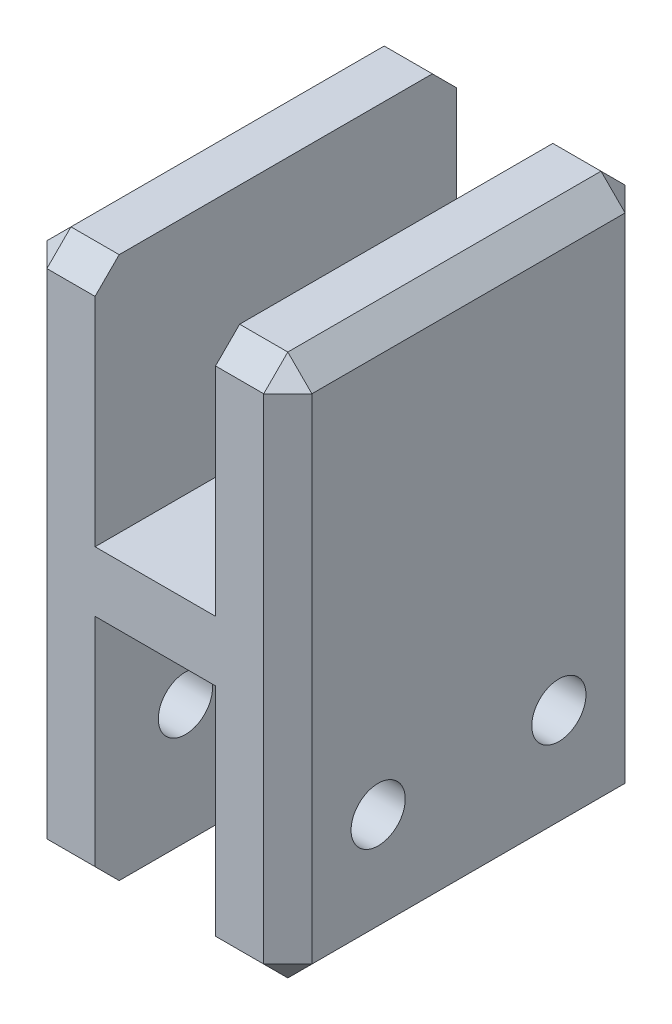
ISO-10303-21;
HEADER;
FILE_DESCRIPTION(('STEP AP214'),'2;1');
FILE_NAME('part.step','',(''),(''),'','','');
FILE_SCHEMA(('AUTOMOTIVE_DESIGN { 1 0 10303 214 1 1 1 1 }'));
ENDSEC;
DATA;
#1=APPLICATION_CONTEXT('core data for automotive mechanical design processes');
#2=APPLICATION_PROTOCOL_DEFINITION('international standard','automotive_design',2000,#1);
#3=PRODUCT_CONTEXT('',#1,'mechanical');
#4=PRODUCT('Part','Part','',(#3));
#5=PRODUCT_RELATED_PRODUCT_CATEGORY('part','',(#4));
#6=PRODUCT_DEFINITION_FORMATION('','',#4);
#7=PRODUCT_DEFINITION_CONTEXT('part definition',#1,'design');
#8=PRODUCT_DEFINITION('design','',#6,#7);
#9=PRODUCT_DEFINITION_SHAPE('','',#8);
#10=(LENGTH_UNIT() NAMED_UNIT(*) SI_UNIT(.MILLI.,.METRE.));
#11=(NAMED_UNIT(*) PLANE_ANGLE_UNIT() SI_UNIT($,.RADIAN.));
#12=(NAMED_UNIT(*) SI_UNIT($,.STERADIAN.) SOLID_ANGLE_UNIT());
#13=UNCERTAINTY_MEASURE_WITH_UNIT(LENGTH_MEASURE(1.E-05),#10,'distance_accuracy_value','');
#14=(GEOMETRIC_REPRESENTATION_CONTEXT(3) GLOBAL_UNCERTAINTY_ASSIGNED_CONTEXT((#13)) GLOBAL_UNIT_ASSIGNED_CONTEXT((#10,
#11,#12)) REPRESENTATION_CONTEXT('',''));
#15=CARTESIAN_POINT('',(0.,0.,0.));
#16=DIRECTION('',(0.,0.,1.));
#17=DIRECTION('',(1.,0.,0.));
#18=AXIS2_PLACEMENT_3D('',#15,#16,#17);
#19=CARTESIAN_POINT('',(-5.,20.,30.));
#20=DIRECTION('',(0.,-1.,0.));
#21=DIRECTION('',(1.,0.,0.));
#22=AXIS2_PLACEMENT_3D('',#19,#20,#21);
#23=PLANE('',#22);
#24=DIRECTION('',(0.,0.,-1.));
#25=VECTOR('',#24,1.);
#26=CARTESIAN_POINT('',(-5.,20.,30.));
#27=LINE('',#26,#25);
#28=CARTESIAN_POINT('',(-5.,20.,28.));
#29=VERTEX_POINT('',#28);
#30=CARTESIAN_POINT('',(-5.,20.,1.99999999999999));
#31=VERTEX_POINT('',#30);
#32=EDGE_CURVE('E241',#29,#31,#27,.T.);
#33=ORIENTED_EDGE('',*,*,#32,.T.);
#34=DIRECTION('',(-1.,0.,0.));
#35=VECTOR('',#34,1.);
#36=CARTESIAN_POINT('',(-11.,20.,1.99999999999999));
#37=LINE('',#36,#35);
#38=CARTESIAN_POINT('',(-9.00000000000001,20.,1.99999999999999));
#39=VERTEX_POINT('',#38);
#40=EDGE_CURVE('E349',#31,#39,#37,.T.);
#41=ORIENTED_EDGE('',*,*,#40,.T.);
#42=DIRECTION('',(0.,0.,1.));
#43=VECTOR('',#42,1.);
#44=CARTESIAN_POINT('',(-9.00000000000001,20.,30.));
#45=LINE('',#44,#43);
#46=CARTESIAN_POINT('',(-9.00000000000001,20.,28.));
#47=VERTEX_POINT('',#46);
#48=EDGE_CURVE('E345',#39,#47,#45,.T.);
#49=ORIENTED_EDGE('',*,*,#48,.T.);
#50=DIRECTION('',(1.,0.,0.));
#51=VECTOR('',#50,1.);
#52=CARTESIAN_POINT('',(-5.,20.,28.));
#53=LINE('',#52,#51);
#54=EDGE_CURVE('E347',#47,#29,#53,.T.);
#55=ORIENTED_EDGE('',*,*,#54,.T.);
#56=EDGE_LOOP('',(#33,#41,#49,#55));
#57=FACE_BOUND('',#56,.T.);
#58=ADVANCED_FACE('F39',(#57),#23,.F.);
#59=CARTESIAN_POINT('',(-11.,-25.,30.));
#60=DIRECTION('',(1.,0.,0.));
#61=DIRECTION('',(0.,1.,0.));
#62=AXIS2_PLACEMENT_3D('',#59,#60,#61);
#63=PLANE('',#62);
#64=DIRECTION('',(0.,1.,0.));
#65=VECTOR('',#64,1.);
#66=CARTESIAN_POINT('',(-11.,-25.,28.));
#67=LINE('',#66,#65);
#68=CARTESIAN_POINT('',(-11.,-23.,28.));
#69=VERTEX_POINT('',#68);
#70=CARTESIAN_POINT('',(-11.,18.,28.));
#71=VERTEX_POINT('',#70);
#72=EDGE_CURVE('E49',#69,#71,#67,.T.);
#73=ORIENTED_EDGE('',*,*,#72,.T.);
#74=DIRECTION('',(0.,0.,-1.));
#75=VECTOR('',#74,1.);
#76=CARTESIAN_POINT('',(-11.,18.,30.));
#77=LINE('',#76,#75);
#78=CARTESIAN_POINT('',(-11.,18.,1.99999999999999));
#79=VERTEX_POINT('',#78);
#80=EDGE_CURVE('E11',#71,#79,#77,.T.);
#81=ORIENTED_EDGE('',*,*,#80,.T.);
#82=DIRECTION('',(0.,-1.,0.));
#83=VECTOR('',#82,1.);
#84=CARTESIAN_POINT('',(-11.,-25.,1.99999999999999));
#85=LINE('',#84,#83);
#86=CARTESIAN_POINT('',(-11.,-23.,1.99999999999999));
#87=VERTEX_POINT('',#86);
#88=EDGE_CURVE('E63',#79,#87,#85,.T.);
#89=ORIENTED_EDGE('',*,*,#88,.T.);
#90=DIRECTION('',(0.,0.,1.));
#91=VECTOR('',#90,1.);
#92=CARTESIAN_POINT('',(-11.,-23.,30.));
#93=LINE('',#92,#91);
#94=EDGE_CURVE('E355',#87,#69,#93,.T.);
#95=ORIENTED_EDGE('',*,*,#94,.T.);
#96=EDGE_LOOP('',(#73,#81,#89,#95));
#97=FACE_BOUND('',#96,.T.);
#98=CARTESIAN_POINT('',(-11.,-15.,7.5));
#99=DIRECTION('',(-1.,0.,0.));
#100=DIRECTION('',(0.,0.,1.));
#101=AXIS2_PLACEMENT_3D('',#98,#99,#100);
#102=CIRCLE('',#101,5.);
#103=CARTESIAN_POINT('',(-11.,-15.,12.5));
#104=VERTEX_POINT('',#103);
#105=EDGE_CURVE('E393',#104,#104,#102,.T.);
#106=ORIENTED_EDGE('',*,*,#105,.F.);
#107=EDGE_LOOP('',(#106));
#108=FACE_BOUND('',#107,.T.);
#109=CARTESIAN_POINT('',(-11.,-15.,22.5));
#110=DIRECTION('',(-1.,0.,0.));
#111=DIRECTION('',(0.,0.,1.));
#112=AXIS2_PLACEMENT_3D('',#109,#110,#111);
#113=CIRCLE('',#112,5.);
#114=CARTESIAN_POINT('',(-11.,-15.,27.5));
#115=VERTEX_POINT('',#114);
#116=EDGE_CURVE('E1118',#115,#115,#113,.T.);
#117=ORIENTED_EDGE('',*,*,#116,.F.);
#118=EDGE_LOOP('',(#117));
#119=FACE_BOUND('',#118,.T.);
#120=ADVANCED_FACE('F452',(#97,#108,#119),#63,.F.);
#121=CARTESIAN_POINT('',(-5.,-25.,30.));
#122=DIRECTION('',(0.,1.,0.));
#123=DIRECTION('',(-1.,0.,0.));
#124=AXIS2_PLACEMENT_3D('',#121,#122,#123);
#125=PLANE('',#124);
#126=DIRECTION('',(0.,0.,-1.));
#127=VECTOR('',#126,1.);
#128=CARTESIAN_POINT('',(-9.00000000000001,-25.,30.));
#129=LINE('',#128,#127);
#130=CARTESIAN_POINT('',(-9.00000000000001,-25.,28.));
#131=VERTEX_POINT('',#130);
#132=CARTESIAN_POINT('',(-9.00000000000001,-25.,1.99999999999999));
#133=VERTEX_POINT('',#132);
#134=EDGE_CURVE('E334',#131,#133,#129,.T.);
#135=ORIENTED_EDGE('',*,*,#134,.T.);
#136=DIRECTION('',(1.,0.,0.));
#137=VECTOR('',#136,1.);
#138=CARTESIAN_POINT('',(-5.,-25.,1.99999999999999));
#139=LINE('',#138,#137);
#140=CARTESIAN_POINT('',(-5.,-25.,1.99999999999999));
#141=VERTEX_POINT('',#140);
#142=EDGE_CURVE('E338',#133,#141,#139,.T.);
#143=ORIENTED_EDGE('',*,*,#142,.T.);
#144=DIRECTION('',(0.,0.,-1.));
#145=VECTOR('',#144,1.);
#146=CARTESIAN_POINT('',(-5.,-25.,30.));
#147=LINE('',#146,#145);
#148=CARTESIAN_POINT('',(-5.,-25.,28.));
#149=VERTEX_POINT('',#148);
#150=EDGE_CURVE('E223',#149,#141,#147,.T.);
#151=ORIENTED_EDGE('',*,*,#150,.F.);
#152=DIRECTION('',(-1.,0.,0.));
#153=VECTOR('',#152,1.);
#154=CARTESIAN_POINT('',(-5.,-25.,28.));
#155=LINE('',#154,#153);
#156=EDGE_CURVE('E336',#149,#131,#155,.T.);
#157=ORIENTED_EDGE('',*,*,#156,.T.);
#158=EDGE_LOOP('',(#135,#143,#151,#157));
#159=FACE_BOUND('',#158,.T.);
#160=ADVANCED_FACE('F471',(#159),#125,.F.);
#161=CARTESIAN_POINT('',(-5.,-5.,30.));
#162=DIRECTION('',(-1.,0.,0.));
#163=DIRECTION('',(0.,-1.,0.));
#164=AXIS2_PLACEMENT_3D('',#161,#162,#163);
#165=PLANE('',#164);
#166=CARTESIAN_POINT('',(-5.,-15.,7.5));
#167=DIRECTION('',(-1.,0.,0.));
#168=DIRECTION('',(0.,-1.,0.));
#169=AXIS2_PLACEMENT_3D('',#166,#167,#168);
#170=CIRCLE('',#169,2.25);
#171=CARTESIAN_POINT('',(-5.,-17.25,7.5));
#172=VERTEX_POINT('',#171);
#173=EDGE_CURVE('E280',#172,#172,#170,.T.);
#174=ORIENTED_EDGE('',*,*,#173,.T.);
#175=EDGE_LOOP('',(#174));
#176=FACE_BOUND('',#175,.T.);
#177=CARTESIAN_POINT('',(-5.,-15.,22.5));
#178=DIRECTION('',(-1.,0.,0.));
#179=DIRECTION('',(0.,-1.,0.));
#180=AXIS2_PLACEMENT_3D('',#177,#178,#179);
#181=CIRCLE('',#180,2.25);
#182=CARTESIAN_POINT('',(-5.,-17.25,22.5));
#183=VERTEX_POINT('',#182);
#184=EDGE_CURVE('E275',#183,#183,#181,.T.);
#185=ORIENTED_EDGE('',*,*,#184,.T.);
#186=EDGE_LOOP('',(#185));
#187=FACE_BOUND('',#186,.T.);
#188=ORIENTED_EDGE('',*,*,#150,.T.);
#189=DIRECTION('',(0.,0.707106781186549,-0.707106781186546));
#190=VECTOR('',#189,1.);
#191=CARTESIAN_POINT('',(-5.,-25.,1.99999999999999));
#192=LINE('',#191,#190);
#193=CARTESIAN_POINT('',(-5.,-23.,0.));
#194=VERTEX_POINT('',#193);
#195=EDGE_CURVE('E343',#141,#194,#192,.T.);
#196=ORIENTED_EDGE('',*,*,#195,.T.);
#197=DIRECTION('',(0.,1.,0.));
#198=VECTOR('',#197,1.);
#199=CARTESIAN_POINT('',(-5.,-5.,0.));
#200=LINE('',#199,#198);
#201=CARTESIAN_POINT('',(-5.,-5.,0.));
#202=VERTEX_POINT('',#201);
#203=EDGE_CURVE('E220',#194,#202,#200,.T.);
#204=ORIENTED_EDGE('',*,*,#203,.T.);
#205=DIRECTION('',(0.,0.,-1.));
#206=VECTOR('',#205,1.);
#207=CARTESIAN_POINT('',(-5.,-5.,30.));
#208=LINE('',#207,#206);
#209=CARTESIAN_POINT('',(-5.,-5.,30.));
#210=VERTEX_POINT('',#209);
#211=EDGE_CURVE('E216',#210,#202,#208,.T.);
#212=ORIENTED_EDGE('',*,*,#211,.F.);
#213=DIRECTION('',(0.,1.,0.));
#214=VECTOR('',#213,1.);
#215=CARTESIAN_POINT('',(-5.,-5.,30.));
#216=LINE('',#215,#214);
#217=CARTESIAN_POINT('',(-5.,-23.,30.));
#218=VERTEX_POINT('',#217);
#219=EDGE_CURVE('E202',#218,#210,#216,.T.);
#220=ORIENTED_EDGE('',*,*,#219,.F.);
#221=DIRECTION('',(0.,0.707106781186549,0.707106781186546));
#222=VECTOR('',#221,1.);
#223=CARTESIAN_POINT('',(-5.,-23.,30.));
#224=LINE('',#223,#222);
#225=EDGE_CURVE('E341',#218,#149,#224,.F.);
#226=ORIENTED_EDGE('',*,*,#225,.T.);
#227=EDGE_LOOP('',(#188,#196,#204,#212,#220,#226));
#228=FACE_BOUND('',#227,.T.);
#229=ADVANCED_FACE('F218',(#176,#187,#228),#165,.F.);
#230=CARTESIAN_POINT('',(5.,-5.,30.));
#231=DIRECTION('',(0.,1.,0.));
#232=DIRECTION('',(0.,0.,1.));
#233=AXIS2_PLACEMENT_3D('',#230,#231,#232);
#234=PLANE('',#233);
#235=DIRECTION('',(1.,0.,0.));
#236=VECTOR('',#235,1.);
#237=CARTESIAN_POINT('',(5.,-5.,0.));
#238=LINE('',#237,#236);
#239=CARTESIAN_POINT('',(5.,-5.,0.));
#240=VERTEX_POINT('',#239);
#241=EDGE_CURVE('E243',#202,#240,#238,.T.);
#242=ORIENTED_EDGE('',*,*,#241,.T.);
#243=DIRECTION('',(0.,0.,-1.));
#244=VECTOR('',#243,1.);
#245=CARTESIAN_POINT('',(5.,-5.,30.));
#246=LINE('',#245,#244);
#247=CARTESIAN_POINT('',(5.,-5.,30.));
#248=VERTEX_POINT('',#247);
#249=EDGE_CURVE('E224',#248,#240,#246,.T.);
#250=ORIENTED_EDGE('',*,*,#249,.F.);
#251=DIRECTION('',(1.,0.,0.));
#252=VECTOR('',#251,1.);
#253=CARTESIAN_POINT('',(5.,-5.,30.));
#254=LINE('',#253,#252);
#255=EDGE_CURVE('E207',#210,#248,#254,.T.);
#256=ORIENTED_EDGE('',*,*,#255,.F.);
#257=ORIENTED_EDGE('',*,*,#211,.T.);
#258=EDGE_LOOP('',(#242,#250,#256,#257));
#259=FACE_BOUND('',#258,.T.);
#260=ADVANCED_FACE('F226',(#259),#234,.F.);
#261=CARTESIAN_POINT('',(5.,-25.,30.));
#262=DIRECTION('',(1.,0.,0.));
#263=DIRECTION('',(0.,1.,0.));
#264=AXIS2_PLACEMENT_3D('',#261,#262,#263);
#265=PLANE('',#264);
#266=CARTESIAN_POINT('',(5.,-15.,7.5));
#267=DIRECTION('',(1.,0.,0.));
#268=DIRECTION('',(0.,1.,0.));
#269=AXIS2_PLACEMENT_3D('',#266,#267,#268);
#270=CIRCLE('',#269,2.25);
#271=CARTESIAN_POINT('',(5.,-12.75,7.5));
#272=VERTEX_POINT('',#271);
#273=EDGE_CURVE('E277',#272,#272,#270,.T.);
#274=ORIENTED_EDGE('',*,*,#273,.T.);
#275=EDGE_LOOP('',(#274));
#276=FACE_BOUND('',#275,.T.);
#277=CARTESIAN_POINT('',(5.,-15.,22.5));
#278=DIRECTION('',(1.,0.,0.));
#279=DIRECTION('',(0.,1.,0.));
#280=AXIS2_PLACEMENT_3D('',#277,#278,#279);
#281=CIRCLE('',#280,2.25);
#282=CARTESIAN_POINT('',(5.,-12.75,22.5));
#283=VERTEX_POINT('',#282);
#284=EDGE_CURVE('E244',#283,#283,#281,.T.);
#285=ORIENTED_EDGE('',*,*,#284,.T.);
#286=EDGE_LOOP('',(#285));
#287=FACE_BOUND('',#286,.T.);
#288=DIRECTION('',(0.,-1.,0.));
#289=VECTOR('',#288,1.);
#290=CARTESIAN_POINT('',(5.,-25.,0.));
#291=LINE('',#290,#289);
#292=CARTESIAN_POINT('',(5.,-23.,0.));
#293=VERTEX_POINT('',#292);
#294=EDGE_CURVE('E246',#240,#293,#291,.T.);
#295=ORIENTED_EDGE('',*,*,#294,.T.);
#296=DIRECTION('',(0.,-0.707106781186548,0.707106781186547));
#297=VECTOR('',#296,1.);
#298=CARTESIAN_POINT('',(5.,-25.,2.));
#299=LINE('',#298,#297);
#300=CARTESIAN_POINT('',(5.,-25.,2.));
#301=VERTEX_POINT('',#300);
#302=EDGE_CURVE('E302',#293,#301,#299,.T.);
#303=ORIENTED_EDGE('',*,*,#302,.T.);
#304=DIRECTION('',(0.,0.,-1.));
#305=VECTOR('',#304,1.);
#306=CARTESIAN_POINT('',(5.,-25.,30.));
#307=LINE('',#306,#305);
#308=CARTESIAN_POINT('',(5.,-25.,28.));
#309=VERTEX_POINT('',#308);
#310=EDGE_CURVE('E266',#309,#301,#307,.T.);
#311=ORIENTED_EDGE('',*,*,#310,.F.);
#312=DIRECTION('',(0.,-0.707106781186548,-0.707106781186547));
#313=VECTOR('',#312,1.);
#314=CARTESIAN_POINT('',(5.,-23.,30.));
#315=LINE('',#314,#313);
#316=CARTESIAN_POINT('',(5.,-23.,30.));
#317=VERTEX_POINT('',#316);
#318=EDGE_CURVE('E300',#309,#317,#315,.F.);
#319=ORIENTED_EDGE('',*,*,#318,.T.);
#320=DIRECTION('',(0.,-1.,0.));
#321=VECTOR('',#320,1.);
#322=CARTESIAN_POINT('',(5.,-25.,30.));
#323=LINE('',#322,#321);
#324=EDGE_CURVE('E229',#248,#317,#323,.T.);
#325=ORIENTED_EDGE('',*,*,#324,.F.);
#326=ORIENTED_EDGE('',*,*,#249,.T.);
#327=EDGE_LOOP('',(#295,#303,#311,#319,#325,#326));
#328=FACE_BOUND('',#327,.T.);
#329=ADVANCED_FACE('F490',(#276,#287,#328),#265,.F.);
#330=CARTESIAN_POINT('',(11.,-25.,30.));
#331=DIRECTION('',(0.,1.,0.));
#332=DIRECTION('',(-1.,0.,0.));
#333=AXIS2_PLACEMENT_3D('',#330,#331,#332);
#334=PLANE('',#333);
#335=ORIENTED_EDGE('',*,*,#310,.T.);
#336=DIRECTION('',(1.,0.,0.));
#337=VECTOR('',#336,1.);
#338=CARTESIAN_POINT('',(11.,-25.,2.));
#339=LINE('',#338,#337);
#340=CARTESIAN_POINT('',(9.,-25.,2.));
#341=VERTEX_POINT('',#340);
#342=EDGE_CURVE('E285',#301,#341,#339,.T.);
#343=ORIENTED_EDGE('',*,*,#342,.T.);
#344=DIRECTION('',(0.,0.,1.));
#345=VECTOR('',#344,1.);
#346=CARTESIAN_POINT('',(9.,-25.,30.));
#347=LINE('',#346,#345);
#348=CARTESIAN_POINT('',(9.,-25.,28.));
#349=VERTEX_POINT('',#348);
#350=EDGE_CURVE('E271',#341,#349,#347,.T.);
#351=ORIENTED_EDGE('',*,*,#350,.T.);
#352=DIRECTION('',(-1.,0.,0.));
#353=VECTOR('',#352,1.);
#354=CARTESIAN_POINT('',(11.,-25.,28.));
#355=LINE('',#354,#353);
#356=EDGE_CURVE('E283',#349,#309,#355,.T.);
#357=ORIENTED_EDGE('',*,*,#356,.T.);
#358=EDGE_LOOP('',(#335,#343,#351,#357));
#359=FACE_BOUND('',#358,.T.);
#360=ADVANCED_FACE('F554',(#359),#334,.F.);
#361=CARTESIAN_POINT('',(11.,-25.,30.));
#362=DIRECTION('',(-1.,0.,0.));
#363=DIRECTION('',(0.,-1.,0.));
#364=AXIS2_PLACEMENT_3D('',#361,#362,#363);
#365=PLANE('',#364);
#366=DIRECTION('',(0.,-1.,0.));
#367=VECTOR('',#366,1.);
#368=CARTESIAN_POINT('',(11.,-25.,28.));
#369=LINE('',#368,#367);
#370=CARTESIAN_POINT('',(11.,18.,28.));
#371=VERTEX_POINT('',#370);
#372=CARTESIAN_POINT('',(11.,-23.,28.));
#373=VERTEX_POINT('',#372);
#374=EDGE_CURVE('E317',#371,#373,#369,.T.);
#375=ORIENTED_EDGE('',*,*,#374,.T.);
#376=DIRECTION('',(0.,0.,-1.));
#377=VECTOR('',#376,1.);
#378=CARTESIAN_POINT('',(11.,-23.,30.));
#379=LINE('',#378,#377);
#380=CARTESIAN_POINT('',(11.,-23.,2.));
#381=VERTEX_POINT('',#380);
#382=EDGE_CURVE('E321',#373,#381,#379,.T.);
#383=ORIENTED_EDGE('',*,*,#382,.T.);
#384=DIRECTION('',(0.,1.,0.));
#385=VECTOR('',#384,1.);
#386=CARTESIAN_POINT('',(11.,20.,2.));
#387=LINE('',#386,#385);
#388=CARTESIAN_POINT('',(11.,18.,2.));
#389=VERTEX_POINT('',#388);
#390=EDGE_CURVE('E319',#381,#389,#387,.T.);
#391=ORIENTED_EDGE('',*,*,#390,.T.);
#392=DIRECTION('',(0.,0.,1.));
#393=VECTOR('',#392,1.);
#394=CARTESIAN_POINT('',(11.,18.,30.));
#395=LINE('',#394,#393);
#396=EDGE_CURVE('E315',#389,#371,#395,.T.);
#397=ORIENTED_EDGE('',*,*,#396,.T.);
#398=EDGE_LOOP('',(#375,#383,#391,#397));
#399=FACE_BOUND('',#398,.T.);
#400=CARTESIAN_POINT('',(11.,-15.,7.5));
#401=DIRECTION('',(-1.,0.,0.));
#402=DIRECTION('',(0.,-1.,0.));
#403=AXIS2_PLACEMENT_3D('',#400,#401,#402);
#404=CIRCLE('',#403,2.25);
#405=CARTESIAN_POINT('',(11.,-17.25,7.5));
#406=VERTEX_POINT('',#405);
#407=EDGE_CURVE('E1121',#406,#406,#404,.T.);
#408=ORIENTED_EDGE('',*,*,#407,.T.);
#409=EDGE_LOOP('',(#408));
#410=FACE_BOUND('',#409,.T.);
#411=CARTESIAN_POINT('',(11.,-15.,22.5));
#412=DIRECTION('',(-1.,0.,0.));
#413=DIRECTION('',(0.,-1.,0.));
#414=AXIS2_PLACEMENT_3D('',#411,#412,#413);
#415=CIRCLE('',#414,2.25);
#416=CARTESIAN_POINT('',(11.,-17.25,22.5));
#417=VERTEX_POINT('',#416);
#418=EDGE_CURVE('E272',#417,#417,#415,.T.);
#419=ORIENTED_EDGE('',*,*,#418,.T.);
#420=EDGE_LOOP('',(#419));
#421=FACE_BOUND('',#420,.T.);
#422=ADVANCED_FACE('F556',(#399,#410,#421),#365,.F.);
#423=CARTESIAN_POINT('',(11.,20.,30.));
#424=DIRECTION('',(0.,-1.,0.));
#425=DIRECTION('',(1.,0.,0.));
#426=AXIS2_PLACEMENT_3D('',#423,#424,#425);
#427=PLANE('',#426);
#428=DIRECTION('',(0.,0.,-1.));
#429=VECTOR('',#428,1.);
#430=CARTESIAN_POINT('',(8.99999999999999,20.,30.));
#431=LINE('',#430,#429);
#432=CARTESIAN_POINT('',(8.99999999999999,20.,28.));
#433=VERTEX_POINT('',#432);
#434=CARTESIAN_POINT('',(8.99999999999999,20.,2.));
#435=VERTEX_POINT('',#434);
#436=EDGE_CURVE('E326',#433,#435,#431,.T.);
#437=ORIENTED_EDGE('',*,*,#436,.T.);
#438=DIRECTION('',(-1.,0.,0.));
#439=VECTOR('',#438,1.);
#440=CARTESIAN_POINT('',(5.,20.,2.));
#441=LINE('',#440,#439);
#442=CARTESIAN_POINT('',(5.,20.,2.));
#443=VERTEX_POINT('',#442);
#444=EDGE_CURVE('E328',#435,#443,#441,.T.);
#445=ORIENTED_EDGE('',*,*,#444,.T.);
#446=DIRECTION('',(0.,0.,-1.));
#447=VECTOR('',#446,1.);
#448=CARTESIAN_POINT('',(5.,20.,30.));
#449=LINE('',#448,#447);
#450=CARTESIAN_POINT('',(5.,20.,28.));
#451=VERTEX_POINT('',#450);
#452=EDGE_CURVE('E263',#451,#443,#449,.T.);
#453=ORIENTED_EDGE('',*,*,#452,.F.);
#454=DIRECTION('',(1.,0.,0.));
#455=VECTOR('',#454,1.);
#456=CARTESIAN_POINT('',(11.,20.,28.));
#457=LINE('',#456,#455);
#458=EDGE_CURVE('E324',#451,#433,#457,.T.);
#459=ORIENTED_EDGE('',*,*,#458,.T.);
#460=EDGE_LOOP('',(#437,#445,#453,#459));
#461=FACE_BOUND('',#460,.T.);
#462=ADVANCED_FACE('F526',(#461),#427,.F.);
#463=CARTESIAN_POINT('',(5.,20.,30.));
#464=DIRECTION('',(1.,0.,0.));
#465=DIRECTION('',(0.,1.,0.));
#466=AXIS2_PLACEMENT_3D('',#463,#464,#465);
#467=PLANE('',#466);
#468=ORIENTED_EDGE('',*,*,#452,.T.);
#469=DIRECTION('',(0.,-0.707106781186547,-0.707106781186548));
#470=VECTOR('',#469,1.);
#471=CARTESIAN_POINT('',(5.,20.,2.));
#472=LINE('',#471,#470);
#473=CARTESIAN_POINT('',(5.,18.,0.));
#474=VERTEX_POINT('',#473);
#475=EDGE_CURVE('E332',#443,#474,#472,.T.);
#476=ORIENTED_EDGE('',*,*,#475,.T.);
#477=DIRECTION('',(0.,-1.,0.));
#478=VECTOR('',#477,1.);
#479=CARTESIAN_POINT('',(5.,20.,0.));
#480=LINE('',#479,#478);
#481=CARTESIAN_POINT('',(5.,0.,0.));
#482=VERTEX_POINT('',#481);
#483=EDGE_CURVE('E249',#474,#482,#480,.T.);
#484=ORIENTED_EDGE('',*,*,#483,.T.);
#485=DIRECTION('',(0.,0.,-1.));
#486=VECTOR('',#485,1.);
#487=CARTESIAN_POINT('',(5.,0.,30.));
#488=LINE('',#487,#486);
#489=CARTESIAN_POINT('',(5.,0.,30.));
#490=VERTEX_POINT('',#489);
#491=EDGE_CURVE('E260',#490,#482,#488,.T.);
#492=ORIENTED_EDGE('',*,*,#491,.F.);
#493=DIRECTION('',(0.,-1.,0.));
#494=VECTOR('',#493,1.);
#495=CARTESIAN_POINT('',(5.,20.,30.));
#496=LINE('',#495,#494);
#497=CARTESIAN_POINT('',(5.,18.,30.));
#498=VERTEX_POINT('',#497);
#499=EDGE_CURVE('E231',#498,#490,#496,.T.);
#500=ORIENTED_EDGE('',*,*,#499,.F.);
#501=DIRECTION('',(0.,-0.707106781186547,0.707106781186548));
#502=VECTOR('',#501,1.);
#503=CARTESIAN_POINT('',(5.,18.,30.));
#504=LINE('',#503,#502);
#505=EDGE_CURVE('E330',#498,#451,#504,.F.);
#506=ORIENTED_EDGE('',*,*,#505,.T.);
#507=EDGE_LOOP('',(#468,#476,#484,#492,#500,#506));
#508=FACE_BOUND('',#507,.T.);
#509=ADVANCED_FACE('F535',(#508),#467,.F.);
#510=CARTESIAN_POINT('',(5.,0.,30.));
#511=DIRECTION('',(0.,-1.,0.));
#512=DIRECTION('',(0.,0.,-1.));
#513=AXIS2_PLACEMENT_3D('',#510,#511,#512);
#514=PLANE('',#513);
#515=DIRECTION('',(-1.,0.,0.));
#516=VECTOR('',#515,1.);
#517=CARTESIAN_POINT('',(5.,0.,0.));
#518=LINE('',#517,#516);
#519=CARTESIAN_POINT('',(-5.,0.,0.));
#520=VERTEX_POINT('',#519);
#521=EDGE_CURVE('E251',#482,#520,#518,.T.);
#522=ORIENTED_EDGE('',*,*,#521,.T.);
#523=DIRECTION('',(0.,0.,-1.));
#524=VECTOR('',#523,1.);
#525=CARTESIAN_POINT('',(-5.,0.,30.));
#526=LINE('',#525,#524);
#527=CARTESIAN_POINT('',(-5.,0.,30.));
#528=VERTEX_POINT('',#527);
#529=EDGE_CURVE('E257',#528,#520,#526,.T.);
#530=ORIENTED_EDGE('',*,*,#529,.F.);
#531=DIRECTION('',(-1.,0.,0.));
#532=VECTOR('',#531,1.);
#533=CARTESIAN_POINT('',(5.,0.,30.));
#534=LINE('',#533,#532);
#535=EDGE_CURVE('E236',#490,#528,#534,.T.);
#536=ORIENTED_EDGE('',*,*,#535,.F.);
#537=ORIENTED_EDGE('',*,*,#491,.T.);
#538=EDGE_LOOP('',(#522,#530,#536,#537));
#539=FACE_BOUND('',#538,.T.);
#540=ADVANCED_FACE('F824',(#539),#514,.F.);
#541=CARTESIAN_POINT('',(-5.,0.,30.));
#542=DIRECTION('',(-1.,0.,0.));
#543=DIRECTION('',(0.,-1.,0.));
#544=AXIS2_PLACEMENT_3D('',#541,#542,#543);
#545=PLANE('',#544);
#546=DIRECTION('',(0.,1.,0.));
#547=VECTOR('',#546,1.);
#548=CARTESIAN_POINT('',(-5.,0.,0.));
#549=LINE('',#548,#547);
#550=CARTESIAN_POINT('',(-5.,18.,0.));
#551=VERTEX_POINT('',#550);
#552=EDGE_CURVE('E213',#520,#551,#549,.T.);
#553=ORIENTED_EDGE('',*,*,#552,.T.);
#554=DIRECTION('',(0.,0.707106781186549,0.707106781186546));
#555=VECTOR('',#554,1.);
#556=CARTESIAN_POINT('',(-5.,20.,1.99999999999999));
#557=LINE('',#556,#555);
#558=EDGE_CURVE('E353',#551,#31,#557,.T.);
#559=ORIENTED_EDGE('',*,*,#558,.T.);
#560=ORIENTED_EDGE('',*,*,#32,.F.);
#561=DIRECTION('',(0.,0.707106781186546,-0.707106781186549));
#562=VECTOR('',#561,1.);
#563=CARTESIAN_POINT('',(-5.,18.,30.));
#564=LINE('',#563,#562);
#565=CARTESIAN_POINT('',(-5.,18.,30.));
#566=VERTEX_POINT('',#565);
#567=EDGE_CURVE('E351',#29,#566,#564,.F.);
#568=ORIENTED_EDGE('',*,*,#567,.T.);
#569=DIRECTION('',(0.,1.,0.));
#570=VECTOR('',#569,1.);
#571=CARTESIAN_POINT('',(-5.,0.,30.));
#572=LINE('',#571,#570);
#573=EDGE_CURVE('E238',#528,#566,#572,.T.);
#574=ORIENTED_EDGE('',*,*,#573,.F.);
#575=ORIENTED_EDGE('',*,*,#529,.T.);
#576=EDGE_LOOP('',(#553,#559,#560,#568,#574,#575));
#577=FACE_BOUND('',#576,.T.);
#578=ADVANCED_FACE('F441',(#577),#545,.F.);
#579=CARTESIAN_POINT('',(0.,0.,30.));
#580=DIRECTION('',(0.,0.,-1.));
#581=DIRECTION('',(-1.,0.,0.));
#582=AXIS2_PLACEMENT_3D('',#579,#580,#581);
#583=PLANE('',#582);
#584=ORIENTED_EDGE('',*,*,#324,.T.);
#585=DIRECTION('',(1.,0.,0.));
#586=VECTOR('',#585,1.);
#587=CARTESIAN_POINT('',(0.,-23.,30.));
#588=LINE('',#587,#586);
#589=CARTESIAN_POINT('',(9.,-23.,30.));
#590=VERTEX_POINT('',#589);
#591=EDGE_CURVE('E313',#317,#590,#588,.T.);
#592=ORIENTED_EDGE('',*,*,#591,.T.);
#593=DIRECTION('',(0.,1.,0.));
#594=VECTOR('',#593,1.);
#595=CARTESIAN_POINT('',(9.,0.,30.));
#596=LINE('',#595,#594);
#597=CARTESIAN_POINT('',(9.,18.,30.));
#598=VERTEX_POINT('',#597);
#599=EDGE_CURVE('E311',#590,#598,#596,.T.);
#600=ORIENTED_EDGE('',*,*,#599,.T.);
#601=DIRECTION('',(-1.,0.,0.));
#602=VECTOR('',#601,1.);
#603=CARTESIAN_POINT('',(0.,18.,30.));
#604=LINE('',#603,#602);
#605=EDGE_CURVE('E309',#598,#498,#604,.T.);
#606=ORIENTED_EDGE('',*,*,#605,.T.);
#607=ORIENTED_EDGE('',*,*,#499,.T.);
#608=ORIENTED_EDGE('',*,*,#535,.T.);
#609=ORIENTED_EDGE('',*,*,#573,.T.);
#610=DIRECTION('',(-1.,0.,0.));
#611=VECTOR('',#610,1.);
#612=CARTESIAN_POINT('',(0.,18.,30.));
#613=LINE('',#612,#611);
#614=CARTESIAN_POINT('',(-9.00000000000001,18.,30.));
#615=VERTEX_POINT('',#614);
#616=EDGE_CURVE('E306',#566,#615,#613,.T.);
#617=ORIENTED_EDGE('',*,*,#616,.T.);
#618=DIRECTION('',(0.,-1.,0.));
#619=VECTOR('',#618,1.);
#620=CARTESIAN_POINT('',(-9.00000000000001,0.,30.));
#621=LINE('',#620,#619);
#622=CARTESIAN_POINT('',(-9.00000000000001,-23.,30.));
#623=VERTEX_POINT('',#622);
#624=EDGE_CURVE('E304',#615,#623,#621,.T.);
#625=ORIENTED_EDGE('',*,*,#624,.T.);
#626=DIRECTION('',(1.,0.,0.));
#627=VECTOR('',#626,1.);
#628=CARTESIAN_POINT('',(0.,-23.,30.));
#629=LINE('',#628,#627);
#630=EDGE_CURVE('E210',#623,#218,#629,.T.);
#631=ORIENTED_EDGE('',*,*,#630,.T.);
#632=ORIENTED_EDGE('',*,*,#219,.T.);
#633=ORIENTED_EDGE('',*,*,#255,.T.);
#634=EDGE_LOOP('',(#584,#592,#600,#606,#607,#608,#609,#617,#625,#631,#632,#633));
#635=FACE_BOUND('',#634,.T.);
#636=ADVANCED_FACE('F205',(#635),#583,.F.);
#637=CARTESIAN_POINT('',(0.,0.,0.));
#638=DIRECTION('',(0.,0.,-1.));
#639=DIRECTION('',(-1.,0.,0.));
#640=AXIS2_PLACEMENT_3D('',#637,#638,#639);
#641=PLANE('',#640);
#642=DIRECTION('',(0.,-1.,0.));
#643=VECTOR('',#642,1.);
#644=CARTESIAN_POINT('',(9.,-25.,0.));
#645=LINE('',#644,#643);
#646=CARTESIAN_POINT('',(8.99999999999999,18.,0.));
#647=VERTEX_POINT('',#646);
#648=CARTESIAN_POINT('',(9.,-23.,0.));
#649=VERTEX_POINT('',#648);
#650=EDGE_CURVE('E296',#647,#649,#645,.T.);
#651=ORIENTED_EDGE('',*,*,#650,.T.);
#652=DIRECTION('',(-1.,0.,0.));
#653=VECTOR('',#652,1.);
#654=CARTESIAN_POINT('',(5.,-23.,0.));
#655=LINE('',#654,#653);
#656=EDGE_CURVE('E298',#649,#293,#655,.T.);
#657=ORIENTED_EDGE('',*,*,#656,.T.);
#658=ORIENTED_EDGE('',*,*,#294,.F.);
#659=ORIENTED_EDGE('',*,*,#241,.F.);
#660=ORIENTED_EDGE('',*,*,#203,.F.);
#661=DIRECTION('',(-1.,0.,0.));
#662=VECTOR('',#661,1.);
#663=CARTESIAN_POINT('',(-11.,-23.,0.));
#664=LINE('',#663,#662);
#665=CARTESIAN_POINT('',(-9.00000000000001,-23.,0.));
#666=VERTEX_POINT('',#665);
#667=EDGE_CURVE('E292',#194,#666,#664,.T.);
#668=ORIENTED_EDGE('',*,*,#667,.T.);
#669=DIRECTION('',(0.,1.,0.));
#670=VECTOR('',#669,1.);
#671=CARTESIAN_POINT('',(-9.00000000000001,20.,0.));
#672=LINE('',#671,#670);
#673=CARTESIAN_POINT('',(-9.00000000000001,18.,0.));
#674=VERTEX_POINT('',#673);
#675=EDGE_CURVE('E288',#666,#674,#672,.T.);
#676=ORIENTED_EDGE('',*,*,#675,.T.);
#677=DIRECTION('',(1.,0.,0.));
#678=VECTOR('',#677,1.);
#679=CARTESIAN_POINT('',(-5.,18.,0.));
#680=LINE('',#679,#678);
#681=EDGE_CURVE('E290',#674,#551,#680,.T.);
#682=ORIENTED_EDGE('',*,*,#681,.T.);
#683=ORIENTED_EDGE('',*,*,#552,.F.);
#684=ORIENTED_EDGE('',*,*,#521,.F.);
#685=ORIENTED_EDGE('',*,*,#483,.F.);
#686=DIRECTION('',(1.,0.,0.));
#687=VECTOR('',#686,1.);
#688=CARTESIAN_POINT('',(11.,18.,0.));
#689=LINE('',#688,#687);
#690=EDGE_CURVE('E294',#474,#647,#689,.T.);
#691=ORIENTED_EDGE('',*,*,#690,.T.);
#692=EDGE_LOOP('',(#651,#657,#658,#659,#660,#668,#676,#682,#683,#684,#685,#691));
#693=FACE_BOUND('',#692,.T.);
#694=ADVANCED_FACE('F486',(#693),#641,.T.);
#695=CARTESIAN_POINT('',(-11.,-15.,22.5));
#696=DIRECTION('',(-1.,0.,0.));
#697=DIRECTION('',(0.,0.,1.));
#698=AXIS2_PLACEMENT_3D('',#695,#696,#697);
#699=CYLINDRICAL_SURFACE('',#698,2.25);
#700=ORIENTED_EDGE('',*,*,#418,.F.);
#701=EDGE_LOOP('',(#700));
#702=FACE_BOUND('',#701,.T.);
#703=ORIENTED_EDGE('',*,*,#284,.F.);
#704=EDGE_LOOP('',(#703));
#705=FACE_BOUND('',#704,.T.);
#706=ADVANCED_FACE('F798',(#702,#705),#699,.F.);
#707=CARTESIAN_POINT('',(-8.4,-15.,22.5));
#708=DIRECTION('',(-1.,0.,0.));
#709=DIRECTION('',(0.,0.,1.));
#710=AXIS2_PLACEMENT_3D('',#707,#708,#709);
#711=CIRCLE('',#710,2.25);
#712=CARTESIAN_POINT('',(-8.4,-15.,24.75));
#713=VERTEX_POINT('',#712);
#714=EDGE_CURVE('E276',#713,#713,#711,.T.);
#715=ORIENTED_EDGE('',*,*,#714,.T.);
#716=EDGE_LOOP('',(#715));
#717=FACE_BOUND('',#716,.T.);
#718=ORIENTED_EDGE('',*,*,#184,.F.);
#719=EDGE_LOOP('',(#718));
#720=FACE_BOUND('',#719,.T.);
#721=ADVANCED_FACE('F790',(#717,#720),#699,.F.);
#722=CARTESIAN_POINT('',(-8.4,-12.75,22.5));
#723=DIRECTION('',(1.,0.,0.));
#724=DIRECTION('',(0.,0.,-1.));
#725=AXIS2_PLACEMENT_3D('',#722,#723,#724);
#726=PLANE('',#725);
#727=ORIENTED_EDGE('',*,*,#714,.F.);
#728=EDGE_LOOP('',(#727));
#729=FACE_BOUND('',#728,.T.);
#730=CARTESIAN_POINT('',(-8.4,-15.,22.5));
#731=DIRECTION('',(-1.,0.,0.));
#732=DIRECTION('',(0.,0.,1.));
#733=AXIS2_PLACEMENT_3D('',#730,#731,#732);
#734=CIRCLE('',#733,5.);
#735=CARTESIAN_POINT('',(-8.4,-15.,27.5));
#736=VERTEX_POINT('',#735);
#737=EDGE_CURVE('E1115',#736,#736,#734,.T.);
#738=ORIENTED_EDGE('',*,*,#737,.T.);
#739=EDGE_LOOP('',(#738));
#740=FACE_BOUND('',#739,.T.);
#741=ADVANCED_FACE('F782',(#729,#740),#726,.F.);
#742=CARTESIAN_POINT('',(-11.,-15.,22.5));
#743=DIRECTION('',(-1.,0.,0.));
#744=DIRECTION('',(0.,0.,1.));
#745=AXIS2_PLACEMENT_3D('',#742,#743,#744);
#746=CYLINDRICAL_SURFACE('',#745,5.);
#747=ORIENTED_EDGE('',*,*,#737,.F.);
#748=EDGE_LOOP('',(#747));
#749=FACE_BOUND('',#748,.T.);
#750=ORIENTED_EDGE('',*,*,#116,.T.);
#751=EDGE_LOOP('',(#750));
#752=FACE_BOUND('',#751,.T.);
#753=ADVANCED_FACE('F775',(#749,#752),#746,.F.);
#754=CARTESIAN_POINT('',(-11.,-15.,7.5));
#755=DIRECTION('',(-1.,0.,0.));
#756=DIRECTION('',(0.,0.,1.));
#757=AXIS2_PLACEMENT_3D('',#754,#755,#756);
#758=CYLINDRICAL_SURFACE('',#757,2.25);
#759=ORIENTED_EDGE('',*,*,#273,.F.);
#760=EDGE_LOOP('',(#759));
#761=FACE_BOUND('',#760,.T.);
#762=ORIENTED_EDGE('',*,*,#407,.F.);
#763=EDGE_LOOP('',(#762));
#764=FACE_BOUND('',#763,.T.);
#765=ADVANCED_FACE('F767',(#761,#764),#758,.F.);
#766=CARTESIAN_POINT('',(-8.4,-15.,7.5));
#767=DIRECTION('',(-1.,0.,0.));
#768=DIRECTION('',(0.,0.,1.));
#769=AXIS2_PLACEMENT_3D('',#766,#767,#768);
#770=CIRCLE('',#769,2.25);
#771=CARTESIAN_POINT('',(-8.4,-15.,9.75));
#772=VERTEX_POINT('',#771);
#773=EDGE_CURVE('E281',#772,#772,#770,.T.);
#774=ORIENTED_EDGE('',*,*,#773,.T.);
#775=EDGE_LOOP('',(#774));
#776=FACE_BOUND('',#775,.T.);
#777=ORIENTED_EDGE('',*,*,#173,.F.);
#778=EDGE_LOOP('',(#777));
#779=FACE_BOUND('',#778,.T.);
#780=ADVANCED_FACE('F759',(#776,#779),#758,.F.);
#781=CARTESIAN_POINT('',(-8.4,-12.75,7.5));
#782=DIRECTION('',(1.,0.,0.));
#783=DIRECTION('',(0.,0.,-1.));
#784=AXIS2_PLACEMENT_3D('',#781,#782,#783);
#785=PLANE('',#784);
#786=ORIENTED_EDGE('',*,*,#773,.F.);
#787=EDGE_LOOP('',(#786));
#788=FACE_BOUND('',#787,.T.);
#789=CARTESIAN_POINT('',(-8.4,-15.,7.5));
#790=DIRECTION('',(-1.,0.,0.));
#791=DIRECTION('',(0.,0.,1.));
#792=AXIS2_PLACEMENT_3D('',#789,#790,#791);
#793=CIRCLE('',#792,5.);
#794=CARTESIAN_POINT('',(-8.4,-15.,12.5));
#795=VERTEX_POINT('',#794);
#796=EDGE_CURVE('E1127',#795,#795,#793,.T.);
#797=ORIENTED_EDGE('',*,*,#796,.T.);
#798=EDGE_LOOP('',(#797));
#799=FACE_BOUND('',#798,.T.);
#800=ADVANCED_FACE('F751',(#788,#799),#785,.F.);
#801=CARTESIAN_POINT('',(-11.,-15.,7.5));
#802=DIRECTION('',(-1.,0.,0.));
#803=DIRECTION('',(0.,0.,1.));
#804=AXIS2_PLACEMENT_3D('',#801,#802,#803);
#805=CYLINDRICAL_SURFACE('',#804,5.);
#806=ORIENTED_EDGE('',*,*,#796,.F.);
#807=EDGE_LOOP('',(#806));
#808=FACE_BOUND('',#807,.T.);
#809=ORIENTED_EDGE('',*,*,#105,.T.);
#810=EDGE_LOOP('',(#809));
#811=FACE_BOUND('',#810,.T.);
#812=ADVANCED_FACE('F636',(#808,#811),#805,.F.);
#813=CARTESIAN_POINT('',(0.,18.,30.));
#814=DIRECTION('',(0.,-0.707106781186548,-0.707106781186547));
#815=DIRECTION('',(-1.,0.,0.));
#816=AXIS2_PLACEMENT_3D('',#813,#814,#815);
#817=PLANE('',#816);
#818=DIRECTION('',(0.,0.707106781186547,-0.707106781186548));
#819=VECTOR('',#818,1.);
#820=CARTESIAN_POINT('',(9.,18.,30.));
#821=LINE('',#820,#819);
#822=EDGE_CURVE('E390',#433,#598,#821,.F.);
#823=ORIENTED_EDGE('',*,*,#822,.F.);
#824=ORIENTED_EDGE('',*,*,#458,.F.);
#825=ORIENTED_EDGE('',*,*,#505,.F.);
#826=ORIENTED_EDGE('',*,*,#605,.F.);
#827=EDGE_LOOP('',(#823,#824,#825,#826));
#828=FACE_BOUND('',#827,.T.);
#829=ADVANCED_FACE('F514',(#828),#817,.F.);
#830=CARTESIAN_POINT('',(9.,18.,30.));
#831=DIRECTION('',(0.577350269189626,0.577350269189626,0.577350269189625));
#832=DIRECTION('',(-0.707106781186548,0.707106781186547,0.));
#833=AXIS2_PLACEMENT_3D('',#830,#831,#832);
#834=PLANE('',#833);
#835=DIRECTION('',(0.707106781186548,-0.707106781186547,0.));
#836=VECTOR('',#835,1.);
#837=CARTESIAN_POINT('',(9.99999999999999,19.,28.));
#838=LINE('',#837,#836);
#839=EDGE_CURVE('E384',#433,#371,#838,.T.);
#840=ORIENTED_EDGE('',*,*,#839,.F.);
#841=ORIENTED_EDGE('',*,*,#822,.T.);
#842=DIRECTION('',(-0.707106781186547,0.,0.707106781186548));
#843=VECTOR('',#842,1.);
#844=CARTESIAN_POINT('',(9.,18.,30.));
#845=LINE('',#844,#843);
#846=EDGE_CURVE('E387',#371,#598,#845,.T.);
#847=ORIENTED_EDGE('',*,*,#846,.F.);
#848=EDGE_LOOP('',(#840,#841,#847));
#849=FACE_BOUND('',#848,.T.);
#850=ADVANCED_FACE('F518',(#849),#834,.T.);
#851=CARTESIAN_POINT('',(0.,-23.,30.));
#852=DIRECTION('',(0.,0.707106781186547,-0.707106781186548));
#853=DIRECTION('',(1.,0.,0.));
#854=AXIS2_PLACEMENT_3D('',#851,#852,#853);
#855=PLANE('',#854);
#856=ORIENTED_EDGE('',*,*,#318,.F.);
#857=ORIENTED_EDGE('',*,*,#356,.F.);
#858=DIRECTION('',(0.,0.707106781186548,0.707106781186547));
#859=VECTOR('',#858,1.);
#860=CARTESIAN_POINT('',(9.,-23.,30.));
#861=LINE('',#860,#859);
#862=EDGE_CURVE('E381',#590,#349,#861,.F.);
#863=ORIENTED_EDGE('',*,*,#862,.F.);
#864=ORIENTED_EDGE('',*,*,#591,.F.);
#865=EDGE_LOOP('',(#856,#857,#863,#864));
#866=FACE_BOUND('',#865,.T.);
#867=ADVANCED_FACE('F498',(#866),#855,.F.);
#868=CARTESIAN_POINT('',(9.,0.,30.));
#869=DIRECTION('',(-0.707106781186548,0.,-0.707106781186547));
#870=DIRECTION('',(0.,1.,0.));
#871=AXIS2_PLACEMENT_3D('',#868,#869,#870);
#872=PLANE('',#871);
#873=ORIENTED_EDGE('',*,*,#846,.T.);
#874=ORIENTED_EDGE('',*,*,#599,.F.);
#875=DIRECTION('',(0.707106781186547,0.,-0.707106781186548));
#876=VECTOR('',#875,1.);
#877=CARTESIAN_POINT('',(9.,-23.,30.));
#878=LINE('',#877,#876);
#879=EDGE_CURVE('E378',#373,#590,#878,.F.);
#880=ORIENTED_EDGE('',*,*,#879,.F.);
#881=ORIENTED_EDGE('',*,*,#374,.F.);
#882=EDGE_LOOP('',(#873,#874,#880,#881));
#883=FACE_BOUND('',#882,.T.);
#884=ADVANCED_FACE('F507',(#883),#872,.F.);
#885=CARTESIAN_POINT('',(8.99999999999999,20.,30.));
#886=DIRECTION('',(-0.707106781186547,-0.707106781186548,0.));
#887=DIRECTION('',(0.,0.,-1.));
#888=AXIS2_PLACEMENT_3D('',#885,#886,#887);
#889=PLANE('',#888);
#890=ORIENTED_EDGE('',*,*,#839,.T.);
#891=ORIENTED_EDGE('',*,*,#396,.F.);
#892=DIRECTION('',(-0.707106781186548,0.707106781186547,0.));
#893=VECTOR('',#892,1.);
#894=CARTESIAN_POINT('',(11.,18.,2.));
#895=LINE('',#894,#893);
#896=EDGE_CURVE('E375',#435,#389,#895,.F.);
#897=ORIENTED_EDGE('',*,*,#896,.F.);
#898=ORIENTED_EDGE('',*,*,#436,.F.);
#899=EDGE_LOOP('',(#890,#891,#897,#898));
#900=FACE_BOUND('',#899,.T.);
#901=ADVANCED_FACE('F523',(#900),#889,.F.);
#902=CARTESIAN_POINT('',(11.,20.,2.));
#903=DIRECTION('',(0.,0.707106781186548,-0.707106781186547));
#904=DIRECTION('',(1.,0.,0.));
#905=AXIS2_PLACEMENT_3D('',#902,#903,#904);
#906=PLANE('',#905);
#907=ORIENTED_EDGE('',*,*,#475,.F.);
#908=ORIENTED_EDGE('',*,*,#444,.F.);
#909=DIRECTION('',(0.,0.707106781186547,0.707106781186548));
#910=VECTOR('',#909,1.);
#911=CARTESIAN_POINT('',(9.,19.,1.));
#912=LINE('',#911,#910);
#913=EDGE_CURVE('E372',#647,#435,#912,.T.);
#914=ORIENTED_EDGE('',*,*,#913,.F.);
#915=ORIENTED_EDGE('',*,*,#690,.F.);
#916=EDGE_LOOP('',(#907,#908,#914,#915));
#917=FACE_BOUND('',#916,.T.);
#918=ADVANCED_FACE('F531',(#917),#906,.T.);
#919=CARTESIAN_POINT('',(9.,-23.,30.));
#920=DIRECTION('',(0.577350269189626,-0.577350269189626,0.577350269189626));
#921=DIRECTION('',(0.707106781186548,0.,-0.707106781186547));
#922=AXIS2_PLACEMENT_3D('',#919,#920,#921);
#923=PLANE('',#922);
#924=ORIENTED_EDGE('',*,*,#879,.T.);
#925=ORIENTED_EDGE('',*,*,#862,.T.);
#926=DIRECTION('',(-0.707106781186548,-0.707106781186547,0.));
#927=VECTOR('',#926,1.);
#928=CARTESIAN_POINT('',(10.,-24.,28.));
#929=LINE('',#928,#927);
#930=EDGE_CURVE('E369',#373,#349,#929,.T.);
#931=ORIENTED_EDGE('',*,*,#930,.F.);
#932=EDGE_LOOP('',(#924,#925,#931));
#933=FACE_BOUND('',#932,.T.);
#934=ADVANCED_FACE('F503',(#933),#923,.T.);
#935=CARTESIAN_POINT('',(11.,18.,2.));
#936=DIRECTION('',(0.577350269189626,0.577350269189626,-0.577350269189625));
#937=DIRECTION('',(-0.707106781186547,0.707106781186547,0.));
#938=AXIS2_PLACEMENT_3D('',#935,#936,#937);
#939=PLANE('',#938);
#940=ORIENTED_EDGE('',*,*,#913,.T.);
#941=ORIENTED_EDGE('',*,*,#896,.T.);
#942=DIRECTION('',(-0.707106781186547,0.,-0.707106781186548));
#943=VECTOR('',#942,1.);
#944=CARTESIAN_POINT('',(11.,18.,2.));
#945=LINE('',#944,#943);
#946=EDGE_CURVE('E366',#647,#389,#945,.F.);
#947=ORIENTED_EDGE('',*,*,#946,.F.);
#948=EDGE_LOOP('',(#940,#941,#947));
#949=FACE_BOUND('',#948,.T.);
#950=ADVANCED_FACE('F595',(#949),#939,.T.);
#951=CARTESIAN_POINT('',(11.,-23.,30.));
#952=DIRECTION('',(-0.707106781186547,0.707106781186548,0.));
#953=DIRECTION('',(0.,0.,-1.));
#954=AXIS2_PLACEMENT_3D('',#951,#952,#953);
#955=PLANE('',#954);
#956=ORIENTED_EDGE('',*,*,#930,.T.);
#957=ORIENTED_EDGE('',*,*,#350,.F.);
#958=DIRECTION('',(0.707106781186548,0.707106781186547,0.));
#959=VECTOR('',#958,1.);
#960=CARTESIAN_POINT('',(8.99999999999999,-25.,2.));
#961=LINE('',#960,#959);
#962=EDGE_CURVE('E363',#381,#341,#961,.F.);
#963=ORIENTED_EDGE('',*,*,#962,.F.);
#964=ORIENTED_EDGE('',*,*,#382,.F.);
#965=EDGE_LOOP('',(#956,#957,#963,#964));
#966=FACE_BOUND('',#965,.T.);
#967=ADVANCED_FACE('F552',(#966),#955,.F.);
#968=CARTESIAN_POINT('',(11.,-25.,2.));
#969=DIRECTION('',(0.707106781186548,0.,-0.707106781186547));
#970=DIRECTION('',(0.,-1.,0.));
#971=AXIS2_PLACEMENT_3D('',#968,#969,#970);
#972=PLANE('',#971);
#973=ORIENTED_EDGE('',*,*,#946,.T.);
#974=ORIENTED_EDGE('',*,*,#390,.F.);
#975=DIRECTION('',(0.707106781186547,0.,0.707106781186548));
#976=VECTOR('',#975,1.);
#977=CARTESIAN_POINT('',(10.,-23.,1.));
#978=LINE('',#977,#976);
#979=EDGE_CURVE('E361',#649,#381,#978,.T.);
#980=ORIENTED_EDGE('',*,*,#979,.F.);
#981=ORIENTED_EDGE('',*,*,#650,.F.);
#982=EDGE_LOOP('',(#973,#974,#980,#981));
#983=FACE_BOUND('',#982,.T.);
#984=ADVANCED_FACE('F542',(#983),#972,.T.);
#985=CARTESIAN_POINT('',(9.,-25.,2.));
#986=DIRECTION('',(0.577350269189625,-0.577350269189625,-0.577350269189626));
#987=DIRECTION('',(-0.707106781186548,0.,-0.707106781186547));
#988=AXIS2_PLACEMENT_3D('',#985,#986,#987);
#989=PLANE('',#988);
#990=ORIENTED_EDGE('',*,*,#979,.T.);
#991=ORIENTED_EDGE('',*,*,#962,.T.);
#992=DIRECTION('',(0.,0.707106781186548,-0.707106781186547));
#993=VECTOR('',#992,1.);
#994=CARTESIAN_POINT('',(9.,-25.,2.));
#995=LINE('',#994,#993);
#996=EDGE_CURVE('E359',#649,#341,#995,.F.);
#997=ORIENTED_EDGE('',*,*,#996,.F.);
#998=EDGE_LOOP('',(#990,#991,#997));
#999=FACE_BOUND('',#998,.T.);
#1000=ADVANCED_FACE('F549',(#999),#989,.T.);
#1001=CARTESIAN_POINT('',(11.,-25.,2.));
#1002=DIRECTION('',(0.,-0.707106781186547,-0.707106781186548));
#1003=DIRECTION('',(-1.,0.,0.));
#1004=AXIS2_PLACEMENT_3D('',#1001,#1002,#1003);
#1005=PLANE('',#1004);
#1006=ORIENTED_EDGE('',*,*,#302,.F.);
#1007=ORIENTED_EDGE('',*,*,#656,.F.);
#1008=ORIENTED_EDGE('',*,*,#996,.T.);
#1009=ORIENTED_EDGE('',*,*,#342,.F.);
#1010=EDGE_LOOP('',(#1006,#1007,#1008,#1009));
#1011=FACE_BOUND('',#1010,.T.);
#1012=ADVANCED_FACE('F547',(#1011),#1005,.T.);
#1013=CARTESIAN_POINT('',(0.,18.,30.));
#1014=DIRECTION('',(0.,-0.707106781186549,-0.707106781186546));
#1015=DIRECTION('',(-1.,0.,0.));
#1016=AXIS2_PLACEMENT_3D('',#1013,#1014,#1015);
#1017=PLANE('',#1016);
#1018=DIRECTION('',(0.,-0.707106781186546,0.707106781186549));
#1019=VECTOR('',#1018,1.);
#1020=CARTESIAN_POINT('',(-9.00000000000001,18.,30.));
#1021=LINE('',#1020,#1019);
#1022=EDGE_CURVE('E44',#615,#47,#1021,.F.);
#1023=ORIENTED_EDGE('',*,*,#1022,.F.);
#1024=ORIENTED_EDGE('',*,*,#616,.F.);
#1025=ORIENTED_EDGE('',*,*,#567,.F.);
#1026=ORIENTED_EDGE('',*,*,#54,.F.);
#1027=EDGE_LOOP('',(#1023,#1024,#1025,#1026));
#1028=FACE_BOUND('',#1027,.T.);
#1029=ADVANCED_FACE('F42',(#1028),#1017,.F.);
#1030=CARTESIAN_POINT('',(-9.00000000000001,18.,30.));
#1031=DIRECTION('',(-0.57735026918963,0.577350269189625,0.577350269189623));
#1032=DIRECTION('',(-0.707106781186544,-0.707106781186551,0.));
#1033=AXIS2_PLACEMENT_3D('',#1030,#1031,#1032);
#1034=PLANE('',#1033);
#1035=DIRECTION('',(-0.707106781186546,0.,-0.707106781186549));
#1036=VECTOR('',#1035,1.);
#1037=CARTESIAN_POINT('',(-9.00000000000001,18.,30.));
#1038=LINE('',#1037,#1036);
#1039=EDGE_CURVE('E420',#615,#71,#1038,.T.);
#1040=ORIENTED_EDGE('',*,*,#1039,.F.);
#1041=ORIENTED_EDGE('',*,*,#1022,.T.);
#1042=DIRECTION('',(0.707106781186545,0.70710678118655,0.));
#1043=VECTOR('',#1042,1.);
#1044=CARTESIAN_POINT('',(-10.,19.,28.));
#1045=LINE('',#1044,#1043);
#1046=EDGE_CURVE('E421',#71,#47,#1045,.T.);
#1047=ORIENTED_EDGE('',*,*,#1046,.F.);
#1048=EDGE_LOOP('',(#1040,#1041,#1047));
#1049=FACE_BOUND('',#1048,.T.);
#1050=ADVANCED_FACE('F431',(#1049),#1034,.T.);
#1051=CARTESIAN_POINT('',(-5.,20.,1.99999999999999));
#1052=DIRECTION('',(0.,0.707106781186546,-0.707106781186549));
#1053=DIRECTION('',(1.,0.,0.));
#1054=AXIS2_PLACEMENT_3D('',#1051,#1052,#1053);
#1055=PLANE('',#1054);
#1056=ORIENTED_EDGE('',*,*,#558,.F.);
#1057=ORIENTED_EDGE('',*,*,#681,.F.);
#1058=DIRECTION('',(0.,-0.707106781186549,-0.707106781186546));
#1059=VECTOR('',#1058,1.);
#1060=CARTESIAN_POINT('',(-9.00000000000001,20.,1.99999999999999));
#1061=LINE('',#1060,#1059);
#1062=EDGE_CURVE('E417',#39,#674,#1061,.T.);
#1063=ORIENTED_EDGE('',*,*,#1062,.F.);
#1064=ORIENTED_EDGE('',*,*,#40,.F.);
#1065=EDGE_LOOP('',(#1056,#1057,#1063,#1064));
#1066=FACE_BOUND('',#1065,.T.);
#1067=ADVANCED_FACE('F447',(#1066),#1055,.T.);
#1068=CARTESIAN_POINT('',(-11.,18.,30.));
#1069=DIRECTION('',(0.70710678118655,-0.707106781186545,0.));
#1070=DIRECTION('',(0.,0.,-1.));
#1071=AXIS2_PLACEMENT_3D('',#1068,#1069,#1070);
#1072=PLANE('',#1071);
#1073=ORIENTED_EDGE('',*,*,#1046,.T.);
#1074=ORIENTED_EDGE('',*,*,#48,.F.);
#1075=DIRECTION('',(-0.707106781186545,-0.70710678118655,0.));
#1076=VECTOR('',#1075,1.);
#1077=CARTESIAN_POINT('',(-9.00000000000001,20.,1.99999999999999));
#1078=LINE('',#1077,#1076);
#1079=EDGE_CURVE('E414',#79,#39,#1078,.F.);
#1080=ORIENTED_EDGE('',*,*,#1079,.F.);
#1081=ORIENTED_EDGE('',*,*,#80,.F.);
#1082=EDGE_LOOP('',(#1073,#1074,#1080,#1081));
#1083=FACE_BOUND('',#1082,.T.);
#1084=ADVANCED_FACE('F450',(#1083),#1072,.F.);
#1085=CARTESIAN_POINT('',(-9.00000000000001,0.,30.));
#1086=DIRECTION('',(0.707106781186549,0.,-0.707106781186546));
#1087=DIRECTION('',(0.,-1.,0.));
#1088=AXIS2_PLACEMENT_3D('',#1085,#1086,#1087);
#1089=PLANE('',#1088);
#1090=ORIENTED_EDGE('',*,*,#1039,.T.);
#1091=ORIENTED_EDGE('',*,*,#72,.F.);
#1092=DIRECTION('',(0.707106781186546,0.,0.707106781186549));
#1093=VECTOR('',#1092,1.);
#1094=CARTESIAN_POINT('',(-10.,-23.,29.));
#1095=LINE('',#1094,#1093);
#1096=EDGE_CURVE('E411',#623,#69,#1095,.F.);
#1097=ORIENTED_EDGE('',*,*,#1096,.F.);
#1098=ORIENTED_EDGE('',*,*,#624,.F.);
#1099=EDGE_LOOP('',(#1090,#1091,#1097,#1098));
#1100=FACE_BOUND('',#1099,.T.);
#1101=ADVANCED_FACE('F480',(#1100),#1089,.F.);
#1102=CARTESIAN_POINT('',(0.,-23.,30.));
#1103=DIRECTION('',(0.,0.707106781186546,-0.707106781186549));
#1104=DIRECTION('',(1.,0.,0.));
#1105=AXIS2_PLACEMENT_3D('',#1102,#1103,#1104);
#1106=PLANE('',#1105);
#1107=ORIENTED_EDGE('',*,*,#225,.F.);
#1108=ORIENTED_EDGE('',*,*,#630,.F.);
#1109=DIRECTION('',(0.,-0.707106781186549,-0.707106781186546));
#1110=VECTOR('',#1109,1.);
#1111=CARTESIAN_POINT('',(-9.00000000000001,-25.,28.));
#1112=LINE('',#1111,#1110);
#1113=EDGE_CURVE('E408',#131,#623,#1112,.F.);
#1114=ORIENTED_EDGE('',*,*,#1113,.F.);
#1115=ORIENTED_EDGE('',*,*,#156,.F.);
#1116=EDGE_LOOP('',(#1107,#1108,#1114,#1115));
#1117=FACE_BOUND('',#1116,.T.);
#1118=ADVANCED_FACE('F474',(#1117),#1106,.F.);
#1119=CARTESIAN_POINT('',(-9.00000000000001,20.,1.99999999999999));
#1120=DIRECTION('',(-0.57735026918963,0.577350269189623,-0.577350269189625));
#1121=DIRECTION('',(-0.707106781186545,0.,0.70710678118655));
#1122=AXIS2_PLACEMENT_3D('',#1119,#1120,#1121);
#1123=PLANE('',#1122);
#1124=ORIENTED_EDGE('',*,*,#1079,.T.);
#1125=ORIENTED_EDGE('',*,*,#1062,.T.);
#1126=DIRECTION('',(-0.707106781186546,0.,0.707106781186549));
#1127=VECTOR('',#1126,1.);
#1128=CARTESIAN_POINT('',(-10.,18.,0.999999999999996));
#1129=LINE('',#1128,#1127);
#1130=EDGE_CURVE('E406',#79,#674,#1129,.F.);
#1131=ORIENTED_EDGE('',*,*,#1130,.F.);
#1132=EDGE_LOOP('',(#1124,#1125,#1131));
#1133=FACE_BOUND('',#1132,.T.);
#1134=ADVANCED_FACE('F663',(#1133),#1123,.T.);
#1135=CARTESIAN_POINT('',(-9.00000000000001,-25.,28.));
#1136=DIRECTION('',(-0.577350269189628,-0.577350269189624,0.577350269189625));
#1137=DIRECTION('',(0.707106781186546,0.,0.707106781186549));
#1138=AXIS2_PLACEMENT_3D('',#1135,#1136,#1137);
#1139=PLANE('',#1138);
#1140=ORIENTED_EDGE('',*,*,#1113,.T.);
#1141=ORIENTED_EDGE('',*,*,#1096,.T.);
#1142=DIRECTION('',(-0.707106781186546,0.707106781186549,0.));
#1143=VECTOR('',#1142,1.);
#1144=CARTESIAN_POINT('',(-9.00000000000001,-25.,28.));
#1145=LINE('',#1144,#1143);
#1146=EDGE_CURVE('E403',#131,#69,#1145,.T.);
#1147=ORIENTED_EDGE('',*,*,#1146,.F.);
#1148=EDGE_LOOP('',(#1140,#1141,#1147));
#1149=FACE_BOUND('',#1148,.T.);
#1150=ADVANCED_FACE('F478',(#1149),#1139,.T.);
#1151=CARTESIAN_POINT('',(-11.,-25.,1.99999999999999));
#1152=DIRECTION('',(-0.707106781186549,0.,-0.707106781186546));
#1153=DIRECTION('',(0.,1.,0.));
#1154=AXIS2_PLACEMENT_3D('',#1151,#1152,#1153);
#1155=PLANE('',#1154);
#1156=ORIENTED_EDGE('',*,*,#1130,.T.);
#1157=ORIENTED_EDGE('',*,*,#675,.F.);
#1158=DIRECTION('',(0.707106781186546,0.,-0.707106781186549));
#1159=VECTOR('',#1158,1.);
#1160=CARTESIAN_POINT('',(-9.00000000000001,-23.,0.));
#1161=LINE('',#1160,#1159);
#1162=EDGE_CURVE('E400',#87,#666,#1161,.T.);
#1163=ORIENTED_EDGE('',*,*,#1162,.F.);
#1164=ORIENTED_EDGE('',*,*,#88,.F.);
#1165=EDGE_LOOP('',(#1156,#1157,#1163,#1164));
#1166=FACE_BOUND('',#1165,.T.);
#1167=ADVANCED_FACE('F462',(#1166),#1155,.T.);
#1168=CARTESIAN_POINT('',(-9.00000000000001,-25.,30.));
#1169=DIRECTION('',(0.707106781186549,0.707106781186546,0.));
#1170=DIRECTION('',(0.,0.,-1.));
#1171=AXIS2_PLACEMENT_3D('',#1168,#1169,#1170);
#1172=PLANE('',#1171);
#1173=ORIENTED_EDGE('',*,*,#1146,.T.);
#1174=ORIENTED_EDGE('',*,*,#94,.F.);
#1175=DIRECTION('',(0.707106781186546,-0.707106781186549,0.));
#1176=VECTOR('',#1175,1.);
#1177=CARTESIAN_POINT('',(-10.,-24.,1.99999999999999));
#1178=LINE('',#1177,#1176);
#1179=EDGE_CURVE('E397',#133,#87,#1178,.F.);
#1180=ORIENTED_EDGE('',*,*,#1179,.F.);
#1181=ORIENTED_EDGE('',*,*,#134,.F.);
#1182=EDGE_LOOP('',(#1173,#1174,#1180,#1181));
#1183=FACE_BOUND('',#1182,.T.);
#1184=ADVANCED_FACE('F457',(#1183),#1172,.F.);
#1185=CARTESIAN_POINT('',(-9.00000000000001,-23.,0.));
#1186=DIRECTION('',(-0.577350269189628,-0.577350269189623,-0.577350269189626));
#1187=DIRECTION('',(-0.707106781186546,0.,0.707106781186549));
#1188=AXIS2_PLACEMENT_3D('',#1185,#1186,#1187);
#1189=PLANE('',#1188);
#1190=ORIENTED_EDGE('',*,*,#1179,.T.);
#1191=ORIENTED_EDGE('',*,*,#1162,.T.);
#1192=DIRECTION('',(0.,-0.707106781186549,0.707106781186546));
#1193=VECTOR('',#1192,1.);
#1194=CARTESIAN_POINT('',(-9.00000000000001,-23.,0.));
#1195=LINE('',#1194,#1193);
#1196=EDGE_CURVE('E394',#133,#666,#1195,.F.);
#1197=ORIENTED_EDGE('',*,*,#1196,.F.);
#1198=EDGE_LOOP('',(#1190,#1191,#1197));
#1199=FACE_BOUND('',#1198,.T.);
#1200=ADVANCED_FACE('F464',(#1199),#1189,.T.);
#1201=CARTESIAN_POINT('',(-5.,-25.,1.99999999999999));
#1202=DIRECTION('',(0.,-0.707106781186546,-0.707106781186549));
#1203=DIRECTION('',(-1.,0.,0.));
#1204=AXIS2_PLACEMENT_3D('',#1201,#1202,#1203);
#1205=PLANE('',#1204);
#1206=ORIENTED_EDGE('',*,*,#1196,.T.);
#1207=ORIENTED_EDGE('',*,*,#667,.F.);
#1208=ORIENTED_EDGE('',*,*,#195,.F.);
#1209=ORIENTED_EDGE('',*,*,#142,.F.);
#1210=EDGE_LOOP('',(#1206,#1207,#1208,#1209));
#1211=FACE_BOUND('',#1210,.T.);
#1212=ADVANCED_FACE('F468',(#1211),#1205,.T.);
#1213=CLOSED_SHELL('',(#58,#120,#160,#229,#260,#329,#360,#422,#462,#509,#540,#578,#636,#694,
#706,#721,#741,#753,#765,#780,#800,#812,#829,#850,#867,#884,#901,#918,#934,#950,#967,#984,#1000,
#1012,#1029,#1050,#1067,#1084,#1101,#1118,#1134,#1150,#1167,#1184,#1200,#1212));
#1214=MANIFOLD_SOLID_BREP('B2',#1213);
#1215=ADVANCED_BREP_SHAPE_REPRESENTATION('',(#18,#1214),#14);
#1216=SHAPE_DEFINITION_REPRESENTATION(#9,#1215);
ENDSEC;
END-ISO-10303-21;
